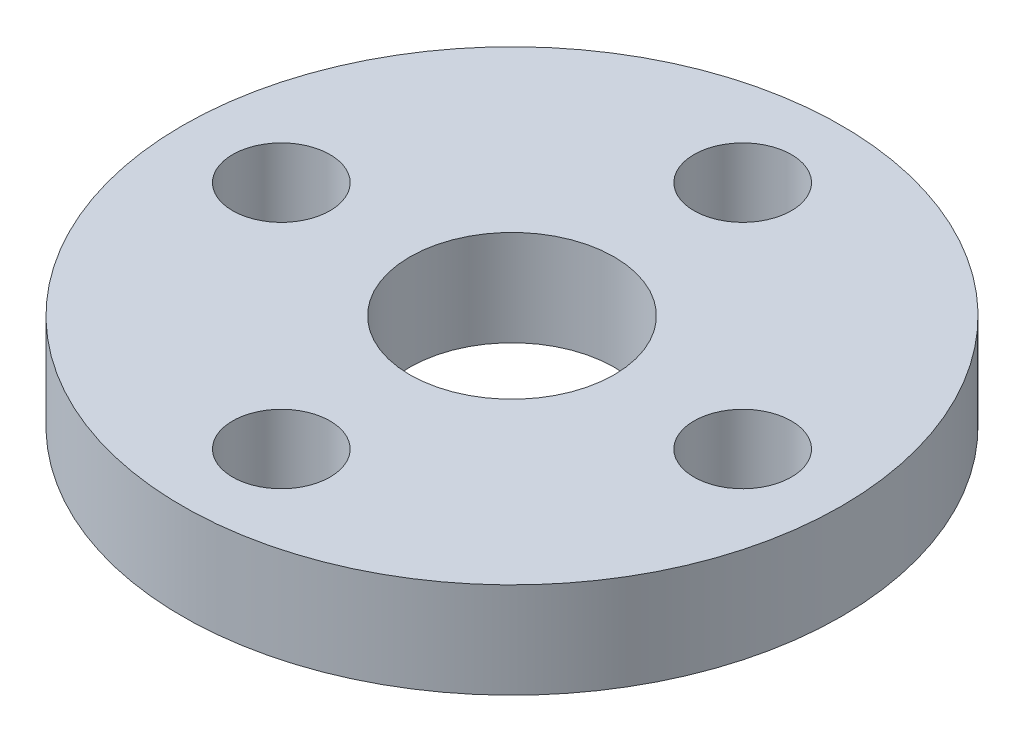
ISO-10303-21;
HEADER;
FILE_DESCRIPTION(('STEP AP214'),'2;1');
FILE_NAME('part.step','',(''),(''),'','','');
FILE_SCHEMA(('AUTOMOTIVE_DESIGN { 1 0 10303 214 1 1 1 1 }'));
ENDSEC;
DATA;
#1=APPLICATION_CONTEXT('core data for automotive mechanical design processes');
#2=APPLICATION_PROTOCOL_DEFINITION('international standard','automotive_design',2000,#1);
#3=PRODUCT_CONTEXT('',#1,'mechanical');
#4=PRODUCT('Part','Part','',(#3));
#5=PRODUCT_RELATED_PRODUCT_CATEGORY('part','',(#4));
#6=PRODUCT_DEFINITION_FORMATION('','',#4);
#7=PRODUCT_DEFINITION_CONTEXT('part definition',#1,'design');
#8=PRODUCT_DEFINITION('design','',#6,#7);
#9=PRODUCT_DEFINITION_SHAPE('','',#8);
#10=(LENGTH_UNIT() NAMED_UNIT(*) SI_UNIT(.MILLI.,.METRE.));
#11=(NAMED_UNIT(*) PLANE_ANGLE_UNIT() SI_UNIT($,.RADIAN.));
#12=(NAMED_UNIT(*) SI_UNIT($,.STERADIAN.) SOLID_ANGLE_UNIT());
#13=UNCERTAINTY_MEASURE_WITH_UNIT(LENGTH_MEASURE(1.E-05),#10,'distance_accuracy_value','');
#14=(GEOMETRIC_REPRESENTATION_CONTEXT(3) GLOBAL_UNCERTAINTY_ASSIGNED_CONTEXT((#13)) GLOBAL_UNIT_ASSIGNED_CONTEXT((#10,
#11,#12)) REPRESENTATION_CONTEXT('',''));
#15=CARTESIAN_POINT('',(0.,0.,0.));
#16=DIRECTION('',(0.,0.,1.));
#17=DIRECTION('',(1.,0.,0.));
#18=AXIS2_PLACEMENT_3D('',#15,#16,#17);
#19=CARTESIAN_POINT('',(-45.,199.95,2.99999999999994));
#20=DIRECTION('',(0.,-1.,0.));
#21=DIRECTION('',(0.,0.,1.));
#22=AXIS2_PLACEMENT_3D('',#19,#20,#21);
#23=CYLINDRICAL_SURFACE('',#22,1.47782604588);
#24=CARTESIAN_POINT('',(-45.,199.95,2.99999999999994));
#25=DIRECTION('',(0.,1.,0.));
#26=DIRECTION('',(-1.,0.,0.));
#27=AXIS2_PLACEMENT_3D('',#24,#25,#26);
#28=CIRCLE('',#27,1.47782604588);
#29=CARTESIAN_POINT('',(-46.47782604588,199.95,2.99999999999994));
#30=VERTEX_POINT('',#29);
#31=EDGE_CURVE('E24',#30,#30,#28,.F.);
#32=ORIENTED_EDGE('',*,*,#31,.F.);
#33=EDGE_LOOP('',(#32));
#34=FACE_BOUND('',#33,.T.);
#35=CARTESIAN_POINT('',(-45.,197.05,2.99999999999994));
#36=DIRECTION('',(0.,1.,0.));
#37=DIRECTION('',(-1.,0.,0.));
#38=AXIS2_PLACEMENT_3D('',#35,#36,#37);
#39=CIRCLE('',#38,1.47782604588);
#40=CARTESIAN_POINT('',(-46.47782604588,197.05,2.99999999999994));
#41=VERTEX_POINT('',#40);
#42=EDGE_CURVE('E49',#41,#41,#39,.F.);
#43=ORIENTED_EDGE('',*,*,#42,.T.);
#44=EDGE_LOOP('',(#43));
#45=FACE_BOUND('',#44,.T.);
#46=ADVANCED_FACE('F15',(#34,#45),#23,.F.);
#47=CARTESIAN_POINT('',(-45.,199.95,17.));
#48=DIRECTION('',(0.,-1.,0.));
#49=DIRECTION('',(0.,0.,1.));
#50=AXIS2_PLACEMENT_3D('',#47,#48,#49);
#51=CYLINDRICAL_SURFACE('',#50,1.47782604588);
#52=CARTESIAN_POINT('',(-45.,199.95,17.));
#53=DIRECTION('',(0.,1.,0.));
#54=DIRECTION('',(1.,0.,0.));
#55=AXIS2_PLACEMENT_3D('',#52,#53,#54);
#56=CIRCLE('',#55,1.47782604588);
#57=CARTESIAN_POINT('',(-43.52217395412,199.95,17.));
#58=VERTEX_POINT('',#57);
#59=EDGE_CURVE('E34',#58,#58,#56,.F.);
#60=ORIENTED_EDGE('',*,*,#59,.F.);
#61=EDGE_LOOP('',(#60));
#62=FACE_BOUND('',#61,.T.);
#63=CARTESIAN_POINT('',(-45.,197.05,17.));
#64=DIRECTION('',(0.,1.,0.));
#65=DIRECTION('',(1.,0.,0.));
#66=AXIS2_PLACEMENT_3D('',#63,#64,#65);
#67=CIRCLE('',#66,1.47782604588);
#68=CARTESIAN_POINT('',(-43.52217395412,197.05,17.));
#69=VERTEX_POINT('',#68);
#70=EDGE_CURVE('E46',#69,#69,#67,.F.);
#71=ORIENTED_EDGE('',*,*,#70,.T.);
#72=EDGE_LOOP('',(#71));
#73=FACE_BOUND('',#72,.T.);
#74=ADVANCED_FACE('F84',(#62,#73),#51,.F.);
#75=CARTESIAN_POINT('',(-38.,199.95,10.));
#76=DIRECTION('',(0.,-1.,0.));
#77=DIRECTION('',(0.,0.,1.));
#78=AXIS2_PLACEMENT_3D('',#75,#76,#77);
#79=CYLINDRICAL_SURFACE('',#78,1.47782604588);
#80=CARTESIAN_POINT('',(-38.,199.95,10.));
#81=DIRECTION('',(0.,1.,0.));
#82=DIRECTION('',(0.,0.,-1.));
#83=AXIS2_PLACEMENT_3D('',#80,#81,#82);
#84=CIRCLE('',#83,1.47782604588);
#85=CARTESIAN_POINT('',(-38.,199.95,8.52217395412));
#86=VERTEX_POINT('',#85);
#87=EDGE_CURVE('E65',#86,#86,#84,.F.);
#88=ORIENTED_EDGE('',*,*,#87,.F.);
#89=EDGE_LOOP('',(#88));
#90=FACE_BOUND('',#89,.T.);
#91=CARTESIAN_POINT('',(-38.,197.05,10.));
#92=DIRECTION('',(0.,1.,0.));
#93=DIRECTION('',(0.,0.,-1.));
#94=AXIS2_PLACEMENT_3D('',#91,#92,#93);
#95=CIRCLE('',#94,1.47782604588);
#96=CARTESIAN_POINT('',(-38.,197.05,8.52217395412));
#97=VERTEX_POINT('',#96);
#98=EDGE_CURVE('E41',#97,#97,#95,.F.);
#99=ORIENTED_EDGE('',*,*,#98,.T.);
#100=EDGE_LOOP('',(#99));
#101=FACE_BOUND('',#100,.T.);
#102=ADVANCED_FACE('F87',(#90,#101),#79,.F.);
#103=CARTESIAN_POINT('',(-45.,199.95,10.));
#104=DIRECTION('',(0.,-1.,0.));
#105=DIRECTION('',(0.,0.,1.));
#106=AXIS2_PLACEMENT_3D('',#103,#104,#105);
#107=CYLINDRICAL_SURFACE('',#106,10.);
#108=CARTESIAN_POINT('',(-45.,199.95,10.));
#109=DIRECTION('',(0.,-1.,0.));
#110=DIRECTION('',(1.,0.,0.));
#111=AXIS2_PLACEMENT_3D('',#108,#109,#110);
#112=CIRCLE('',#111,10.);
#113=CARTESIAN_POINT('',(-35.,199.95,10.));
#114=VERTEX_POINT('',#113);
#115=EDGE_CURVE('E59',#114,#114,#112,.F.);
#116=ORIENTED_EDGE('',*,*,#115,.F.);
#117=EDGE_LOOP('',(#116));
#118=FACE_BOUND('',#117,.T.);
#119=CARTESIAN_POINT('',(-45.,197.05,10.));
#120=DIRECTION('',(0.,-1.,0.));
#121=DIRECTION('',(1.,0.,0.));
#122=AXIS2_PLACEMENT_3D('',#119,#120,#121);
#123=CIRCLE('',#122,10.);
#124=CARTESIAN_POINT('',(-35.,197.05,10.));
#125=VERTEX_POINT('',#124);
#126=EDGE_CURVE('E38',#125,#125,#123,.F.);
#127=ORIENTED_EDGE('',*,*,#126,.T.);
#128=EDGE_LOOP('',(#127));
#129=FACE_BOUND('',#128,.T.);
#130=ADVANCED_FACE('F17',(#118,#129),#107,.T.);
#131=CARTESIAN_POINT('',(-52.,199.95,10.));
#132=DIRECTION('',(0.,-1.,0.));
#133=DIRECTION('',(0.,0.,1.));
#134=AXIS2_PLACEMENT_3D('',#131,#132,#133);
#135=CYLINDRICAL_SURFACE('',#134,1.47782604588);
#136=CARTESIAN_POINT('',(-52.,199.95,10.));
#137=DIRECTION('',(0.,-1.,0.));
#138=DIRECTION('',(0.,0.,1.));
#139=AXIS2_PLACEMENT_3D('',#136,#137,#138);
#140=CIRCLE('',#139,1.47782604588);
#141=CARTESIAN_POINT('',(-52.,199.95,11.47782604588));
#142=VERTEX_POINT('',#141);
#143=EDGE_CURVE('E10',#142,#142,#140,.F.);
#144=ORIENTED_EDGE('',*,*,#143,.T.);
#145=EDGE_LOOP('',(#144));
#146=FACE_BOUND('',#145,.T.);
#147=CARTESIAN_POINT('',(-52.,197.05,10.));
#148=DIRECTION('',(0.,-1.,0.));
#149=DIRECTION('',(0.,0.,1.));
#150=AXIS2_PLACEMENT_3D('',#147,#148,#149);
#151=CIRCLE('',#150,1.47782604588);
#152=CARTESIAN_POINT('',(-52.,197.05,11.47782604588));
#153=VERTEX_POINT('',#152);
#154=EDGE_CURVE('E19',#153,#153,#151,.F.);
#155=ORIENTED_EDGE('',*,*,#154,.F.);
#156=EDGE_LOOP('',(#155));
#157=FACE_BOUND('',#156,.T.);
#158=ADVANCED_FACE('F104',(#146,#157),#135,.F.);
#159=CARTESIAN_POINT('',(-41.5,199.95,10.));
#160=DIRECTION('',(0.,1.,0.));
#161=DIRECTION('',(0.,0.,-1.));
#162=AXIS2_PLACEMENT_3D('',#159,#160,#161);
#163=PLANE('',#162);
#164=CARTESIAN_POINT('',(-45.,199.95,10.));
#165=DIRECTION('',(0.,-1.,0.));
#166=DIRECTION('',(0.,0.,-1.));
#167=AXIS2_PLACEMENT_3D('',#164,#165,#166);
#168=CIRCLE('',#167,3.1);
#169=CARTESIAN_POINT('',(-45.,199.95,6.9));
#170=VERTEX_POINT('',#169);
#171=EDGE_CURVE('E75',#170,#170,#168,.F.);
#172=ORIENTED_EDGE('',*,*,#171,.F.);
#173=EDGE_LOOP('',(#172));
#174=FACE_BOUND('',#173,.T.);
#175=ORIENTED_EDGE('',*,*,#115,.T.);
#176=EDGE_LOOP('',(#175));
#177=FACE_BOUND('',#176,.T.);
#178=ORIENTED_EDGE('',*,*,#87,.T.);
#179=EDGE_LOOP('',(#178));
#180=FACE_BOUND('',#179,.T.);
#181=ORIENTED_EDGE('',*,*,#59,.T.);
#182=EDGE_LOOP('',(#181));
#183=FACE_BOUND('',#182,.T.);
#184=ORIENTED_EDGE('',*,*,#31,.T.);
#185=EDGE_LOOP('',(#184));
#186=FACE_BOUND('',#185,.T.);
#187=ORIENTED_EDGE('',*,*,#143,.F.);
#188=EDGE_LOOP('',(#187));
#189=FACE_BOUND('',#188,.T.);
#190=ADVANCED_FACE('F81',(#174,#177,#180,#183,#186,#189),#163,.T.);
#191=CARTESIAN_POINT('',(-41.5,197.05,10.));
#192=DIRECTION('',(0.,1.,0.));
#193=DIRECTION('',(0.,0.,-1.));
#194=AXIS2_PLACEMENT_3D('',#191,#192,#193);
#195=PLANE('',#194);
#196=CARTESIAN_POINT('',(-45.,197.05,10.));
#197=DIRECTION('',(0.,-1.,0.));
#198=DIRECTION('',(1.,0.,0.));
#199=AXIS2_PLACEMENT_3D('',#196,#197,#198);
#200=CIRCLE('',#199,3.1);
#201=CARTESIAN_POINT('',(-41.9,197.05,10.));
#202=VERTEX_POINT('',#201);
#203=EDGE_CURVE('E42',#202,#202,#200,.F.);
#204=ORIENTED_EDGE('',*,*,#203,.T.);
#205=EDGE_LOOP('',(#204));
#206=FACE_BOUND('',#205,.T.);
#207=ORIENTED_EDGE('',*,*,#126,.F.);
#208=EDGE_LOOP('',(#207));
#209=FACE_BOUND('',#208,.T.);
#210=ORIENTED_EDGE('',*,*,#98,.F.);
#211=EDGE_LOOP('',(#210));
#212=FACE_BOUND('',#211,.T.);
#213=ORIENTED_EDGE('',*,*,#70,.F.);
#214=EDGE_LOOP('',(#213));
#215=FACE_BOUND('',#214,.T.);
#216=ORIENTED_EDGE('',*,*,#42,.F.);
#217=EDGE_LOOP('',(#216));
#218=FACE_BOUND('',#217,.T.);
#219=ORIENTED_EDGE('',*,*,#154,.T.);
#220=EDGE_LOOP('',(#219));
#221=FACE_BOUND('',#220,.T.);
#222=ADVANCED_FACE('F91',(#206,#209,#212,#215,#218,#221),#195,.F.);
#223=CARTESIAN_POINT('',(-45.,200.24,10.));
#224=DIRECTION('',(0.,-1.,0.));
#225=DIRECTION('',(0.,0.,1.));
#226=AXIS2_PLACEMENT_3D('',#223,#224,#225);
#227=CYLINDRICAL_SURFACE('',#226,3.1);
#228=ORIENTED_EDGE('',*,*,#203,.F.);
#229=EDGE_LOOP('',(#228));
#230=FACE_BOUND('',#229,.T.);
#231=ORIENTED_EDGE('',*,*,#171,.T.);
#232=EDGE_LOOP('',(#231));
#233=FACE_BOUND('',#232,.T.);
#234=ADVANCED_FACE('F94',(#230,#233),#227,.F.);
#235=CLOSED_SHELL('',(#46,#74,#102,#130,#158,#190,#222,#234));
#236=MANIFOLD_SOLID_BREP('B1',#235);
#237=ADVANCED_BREP_SHAPE_REPRESENTATION('',(#18,#236),#14);
#238=SHAPE_DEFINITION_REPRESENTATION(#9,#237);
ENDSEC;
END-ISO-10303-21;
